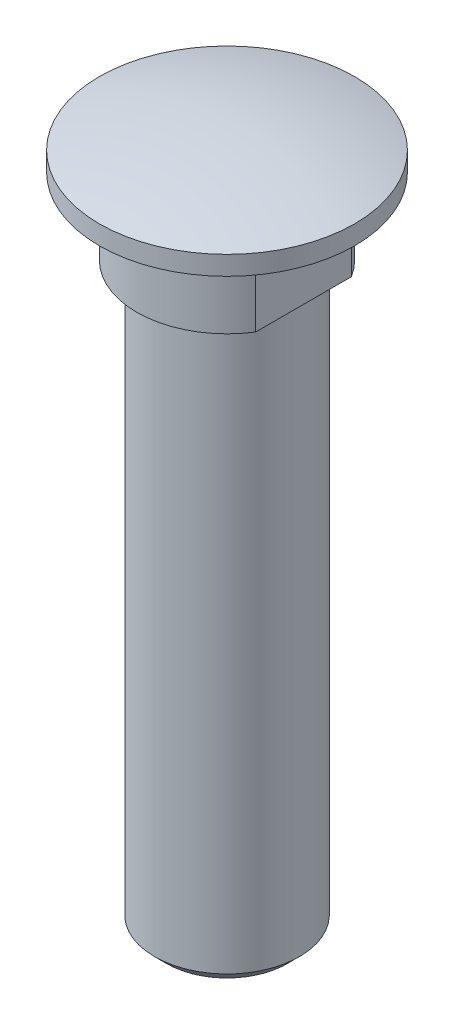
ISO-10303-21;
HEADER;
FILE_DESCRIPTION(('STEP AP214'),'2;1');
FILE_NAME('part.step','',(''),(''),'','','');
FILE_SCHEMA(('AUTOMOTIVE_DESIGN { 1 0 10303 214 1 1 1 1 }'));
ENDSEC;
DATA;
#1=APPLICATION_CONTEXT('core data for automotive mechanical design processes');
#2=APPLICATION_PROTOCOL_DEFINITION('international standard','automotive_design',2000,#1);
#3=PRODUCT_CONTEXT('',#1,'mechanical');
#4=PRODUCT('Part','Part','',(#3));
#5=PRODUCT_RELATED_PRODUCT_CATEGORY('part','',(#4));
#6=PRODUCT_DEFINITION_FORMATION('','',#4);
#7=PRODUCT_DEFINITION_CONTEXT('part definition',#1,'design');
#8=PRODUCT_DEFINITION('design','',#6,#7);
#9=PRODUCT_DEFINITION_SHAPE('','',#8);
#10=(LENGTH_UNIT() NAMED_UNIT(*) SI_UNIT(.MILLI.,.METRE.));
#11=(NAMED_UNIT(*) PLANE_ANGLE_UNIT() SI_UNIT($,.RADIAN.));
#12=(NAMED_UNIT(*) SI_UNIT($,.STERADIAN.) SOLID_ANGLE_UNIT());
#13=UNCERTAINTY_MEASURE_WITH_UNIT(LENGTH_MEASURE(1.E-05),#10,'distance_accuracy_value','');
#14=(GEOMETRIC_REPRESENTATION_CONTEXT(3) GLOBAL_UNCERTAINTY_ASSIGNED_CONTEXT((#13)) GLOBAL_UNIT_ASSIGNED_CONTEXT((#10,
#11,#12)) REPRESENTATION_CONTEXT('',''));
#15=CARTESIAN_POINT('',(0.,0.,0.));
#16=DIRECTION('',(0.,0.,1.));
#17=DIRECTION('',(1.,0.,0.));
#18=AXIS2_PLACEMENT_3D('',#15,#16,#17);
#19=CARTESIAN_POINT('',(0.,-2.3114,0.));
#20=DIRECTION('',(0.,1.,0.));
#21=DIRECTION('',(0.,0.,-1.));
#22=AXIS2_PLACEMENT_3D('',#19,#20,#21);
#23=CYLINDRICAL_SURFACE('',#22,2.413);
#24=CARTESIAN_POINT('',(0.,0.396875,0.));
#25=DIRECTION('',(0.,1.,0.));
#26=DIRECTION('',(0.,0.,1.));
#27=AXIS2_PLACEMENT_3D('',#24,#25,#26);
#28=CIRCLE('',#27,2.413);
#29=CARTESIAN_POINT('',(0.,0.396875,2.413));
#30=VERTEX_POINT('',#29);
#31=EDGE_CURVE('E9',#30,#30,#28,.T.);
#32=ORIENTED_EDGE('',*,*,#31,.T.);
#33=EDGE_LOOP('',(#32));
#34=FACE_BOUND('',#33,.T.);
#35=CARTESIAN_POINT('',(0.,19.2090675,0.));
#36=DIRECTION('',(0.,-1.,0.));
#37=DIRECTION('',(0.,0.,1.));
#38=AXIS2_PLACEMENT_3D('',#35,#36,#37);
#39=CIRCLE('',#38,2.413);
#40=CARTESIAN_POINT('',(0.,19.2090675,2.413));
#41=VERTEX_POINT('',#40);
#42=EDGE_CURVE('E84',#41,#41,#39,.T.);
#43=ORIENTED_EDGE('',*,*,#42,.T.);
#44=EDGE_LOOP('',(#43));
#45=FACE_BOUND('',#44,.T.);
#46=ADVANCED_FACE('F15',(#34,#45),#23,.T.);
#47=CARTESIAN_POINT('',(0.,0.,0.));
#48=DIRECTION('',(0.,1.,0.));
#49=DIRECTION('',(0.,0.,1.));
#50=AXIS2_PLACEMENT_3D('',#47,#48,#49);
#51=CONICAL_SURFACE('',#50,2.016125,0.785398163397449);
#52=ORIENTED_EDGE('',*,*,#31,.F.);
#53=EDGE_LOOP('',(#52));
#54=FACE_BOUND('',#53,.T.);
#55=CARTESIAN_POINT('',(0.,0.,0.));
#56=DIRECTION('',(0.,-1.,0.));
#57=DIRECTION('',(0.,0.,1.));
#58=AXIS2_PLACEMENT_3D('',#55,#56,#57);
#59=CIRCLE('',#58,2.016125);
#60=CARTESIAN_POINT('',(0.,0.,2.016125));
#61=VERTEX_POINT('',#60);
#62=EDGE_CURVE('E101',#61,#61,#59,.T.);
#63=ORIENTED_EDGE('',*,*,#62,.F.);
#64=EDGE_LOOP('',(#63));
#65=FACE_BOUND('',#64,.T.);
#66=ADVANCED_FACE('F17',(#54,#65),#51,.T.);
#67=CARTESIAN_POINT('',(-2.5527,19.304,3.73263621531094));
#68=DIRECTION('',(-1.,0.,0.));
#69=DIRECTION('',(0.,0.,1.));
#70=AXIS2_PLACEMENT_3D('',#67,#68,#69);
#71=PLANE('',#70);
#72=DIRECTION('',(0.,-1.,0.));
#73=VECTOR('',#72,1.);
#74=CARTESIAN_POINT('',(-2.5527,-2.3114,-1.59474785467797));
#75=LINE('',#74,#73);
#76=CARTESIAN_POINT('',(-2.5527,21.844,-1.59474785467798));
#77=VERTEX_POINT('',#76);
#78=CARTESIAN_POINT('',(-2.5527,19.304,-1.59474785467797));
#79=VERTEX_POINT('',#78);
#80=EDGE_CURVE('E26',#77,#79,#75,.T.);
#81=ORIENTED_EDGE('',*,*,#80,.T.);
#82=DIRECTION('',(0.,0.,-1.));
#83=VECTOR('',#82,1.);
#84=CARTESIAN_POINT('',(-2.5527,19.304,3.73263621531094));
#85=LINE('',#84,#83);
#86=CARTESIAN_POINT('',(-2.5527,19.304,1.59474785467798));
#87=VERTEX_POINT('',#86);
#88=EDGE_CURVE('E39',#87,#79,#85,.T.);
#89=ORIENTED_EDGE('',*,*,#88,.F.);
#90=DIRECTION('',(0.,1.,0.));
#91=VECTOR('',#90,1.);
#92=CARTESIAN_POINT('',(-2.5527,-2.3114,1.59474785467797));
#93=LINE('',#92,#91);
#94=CARTESIAN_POINT('',(-2.5527,21.844,1.59474785467798));
#95=VERTEX_POINT('',#94);
#96=EDGE_CURVE('E109',#87,#95,#93,.T.);
#97=ORIENTED_EDGE('',*,*,#96,.T.);
#98=DIRECTION('',(0.,0.,-1.));
#99=VECTOR('',#98,1.);
#100=CARTESIAN_POINT('',(-2.5527,21.844,3.73263621531094));
#101=LINE('',#100,#99);
#102=EDGE_CURVE('E107',#95,#77,#101,.T.);
#103=ORIENTED_EDGE('',*,*,#102,.T.);
#104=EDGE_LOOP('',(#81,#89,#97,#103));
#105=FACE_BOUND('',#104,.T.);
#106=ADVANCED_FACE('F148',(#105),#71,.T.);
#107=CARTESIAN_POINT('',(-4.2545,21.844,0.));
#108=DIRECTION('',(0.,1.,0.));
#109=DIRECTION('',(1.,0.,0.));
#110=AXIS2_PLACEMENT_3D('',#107,#108,#109);
#111=PLANE('',#110);
#112=CARTESIAN_POINT('',(0.,21.844,0.));
#113=DIRECTION('',(0.,-1.,0.));
#114=DIRECTION('',(0.,0.,-1.));
#115=AXIS2_PLACEMENT_3D('',#112,#113,#114);
#116=CIRCLE('',#115,4.2545);
#117=CARTESIAN_POINT('',(0.,21.844,-4.2545));
#118=VERTEX_POINT('',#117);
#119=EDGE_CURVE('E19',#118,#118,#116,.T.);
#120=ORIENTED_EDGE('',*,*,#119,.T.);
#121=EDGE_LOOP('',(#120));
#122=FACE_BOUND('',#121,.T.);
#123=DIRECTION('',(0.,0.,-1.));
#124=VECTOR('',#123,1.);
#125=CARTESIAN_POINT('',(2.5527,21.844,3.73263621531094));
#126=LINE('',#125,#124);
#127=CARTESIAN_POINT('',(2.5527,21.844,1.59474785467798));
#128=VERTEX_POINT('',#127);
#129=CARTESIAN_POINT('',(2.5527,21.844,-1.59474785467798));
#130=VERTEX_POINT('',#129);
#131=EDGE_CURVE('E117',#128,#130,#126,.T.);
#132=ORIENTED_EDGE('',*,*,#131,.T.);
#133=CARTESIAN_POINT('',(0.,21.844,0.));
#134=DIRECTION('',(0.,-1.,0.));
#135=DIRECTION('',(0.,0.,-1.));
#136=AXIS2_PLACEMENT_3D('',#133,#134,#135);
#137=CIRCLE('',#136,3.0099);
#138=EDGE_CURVE('E79',#77,#130,#137,.T.);
#139=ORIENTED_EDGE('',*,*,#138,.F.);
#140=ORIENTED_EDGE('',*,*,#102,.F.);
#141=EDGE_CURVE('E105',#128,#95,#137,.T.);
#142=ORIENTED_EDGE('',*,*,#141,.F.);
#143=EDGE_LOOP('',(#132,#139,#140,#142));
#144=FACE_BOUND('',#143,.T.);
#145=ADVANCED_FACE('F154',(#122,#144),#111,.F.);
#146=CARTESIAN_POINT('',(0.,-2.3114,0.));
#147=DIRECTION('',(0.,1.,0.));
#148=DIRECTION('',(0.,0.,-1.));
#149=AXIS2_PLACEMENT_3D('',#146,#147,#148);
#150=CYLINDRICAL_SURFACE('',#149,3.0099);
#151=ORIENTED_EDGE('',*,*,#96,.F.);
#152=CARTESIAN_POINT('',(0.,19.304,0.));
#153=DIRECTION('',(0.,-1.,0.));
#154=DIRECTION('',(0.,0.,-1.));
#155=AXIS2_PLACEMENT_3D('',#152,#153,#154);
#156=CIRCLE('',#155,3.0099);
#157=CARTESIAN_POINT('',(2.5527,19.304,1.59474785467798));
#158=VERTEX_POINT('',#157);
#159=EDGE_CURVE('E73',#158,#87,#156,.T.);
#160=ORIENTED_EDGE('',*,*,#159,.F.);
#161=DIRECTION('',(0.,1.,0.));
#162=VECTOR('',#161,1.);
#163=CARTESIAN_POINT('',(2.5527,-2.3114,1.59474785467798));
#164=LINE('',#163,#162);
#165=EDGE_CURVE('E89',#158,#128,#164,.T.);
#166=ORIENTED_EDGE('',*,*,#165,.T.);
#167=ORIENTED_EDGE('',*,*,#141,.T.);
#168=EDGE_LOOP('',(#151,#160,#166,#167));
#169=FACE_BOUND('',#168,.T.);
#170=ADVANCED_FACE('F146',(#169),#150,.T.);
#171=CARTESIAN_POINT('',(0.,19.2090675,0.));
#172=DIRECTION('',(0.,1.,0.));
#173=DIRECTION('',(0.,0.,1.));
#174=AXIS2_PLACEMENT_3D('',#171,#172,#173);
#175=TOROIDAL_SURFACE('',#174,2.5079325,0.0949325);
#176=ORIENTED_EDGE('',*,*,#42,.F.);
#177=EDGE_LOOP('',(#176));
#178=FACE_BOUND('',#177,.T.);
#179=CARTESIAN_POINT('',(0.,19.304,0.));
#180=DIRECTION('',(0.,1.,0.));
#181=DIRECTION('',(0.,0.,1.));
#182=AXIS2_PLACEMENT_3D('',#179,#180,#181);
#183=CIRCLE('',#182,2.5079325);
#184=CARTESIAN_POINT('',(0.,19.304,2.5079325));
#185=VERTEX_POINT('',#184);
#186=EDGE_CURVE('E134',#185,#185,#183,.T.);
#187=ORIENTED_EDGE('',*,*,#186,.F.);
#188=EDGE_LOOP('',(#187));
#189=FACE_BOUND('',#188,.T.);
#190=ADVANCED_FACE('F241',(#178,#189),#175,.F.);
#191=CARTESIAN_POINT('',(0.,0.,0.));
#192=DIRECTION('',(0.,1.,0.));
#193=DIRECTION('',(1.,0.,0.));
#194=AXIS2_PLACEMENT_3D('',#191,#192,#193);
#195=PLANE('',#194);
#196=ORIENTED_EDGE('',*,*,#62,.T.);
#197=EDGE_LOOP('',(#196));
#198=FACE_BOUND('',#197,.T.);
#199=ADVANCED_FACE('F250',(#198),#195,.F.);
#200=ORIENTED_EDGE('',*,*,#80,.F.);
#201=ORIENTED_EDGE('',*,*,#138,.T.);
#202=DIRECTION('',(0.,-1.,0.));
#203=VECTOR('',#202,1.);
#204=CARTESIAN_POINT('',(2.5527,-2.3114,-1.59474785467798));
#205=LINE('',#204,#203);
#206=CARTESIAN_POINT('',(2.5527,19.304,-1.59474785467797));
#207=VERTEX_POINT('',#206);
#208=EDGE_CURVE('E76',#130,#207,#205,.T.);
#209=ORIENTED_EDGE('',*,*,#208,.T.);
#210=EDGE_CURVE('E64',#79,#207,#156,.T.);
#211=ORIENTED_EDGE('',*,*,#210,.F.);
#212=EDGE_LOOP('',(#200,#201,#209,#211));
#213=FACE_BOUND('',#212,.T.);
#214=ADVANCED_FACE('F77',(#213),#150,.T.);
#215=CARTESIAN_POINT('',(2.5527,19.304,3.73263621531094));
#216=DIRECTION('',(-1.,0.,0.));
#217=DIRECTION('',(0.,0.,1.));
#218=AXIS2_PLACEMENT_3D('',#215,#216,#217);
#219=PLANE('',#218);
#220=ORIENTED_EDGE('',*,*,#131,.F.);
#221=ORIENTED_EDGE('',*,*,#165,.F.);
#222=DIRECTION('',(0.,0.,-1.));
#223=VECTOR('',#222,1.);
#224=CARTESIAN_POINT('',(2.5527,19.304,3.73263621531094));
#225=LINE('',#224,#223);
#226=EDGE_CURVE('E69',#158,#207,#225,.T.);
#227=ORIENTED_EDGE('',*,*,#226,.T.);
#228=ORIENTED_EDGE('',*,*,#208,.F.);
#229=EDGE_LOOP('',(#220,#221,#227,#228));
#230=FACE_BOUND('',#229,.T.);
#231=ADVANCED_FACE('F87',(#230),#219,.F.);
#232=CARTESIAN_POINT('',(-3.0099,19.304,0.));
#233=DIRECTION('',(0.,1.,0.));
#234=DIRECTION('',(1.,0.,0.));
#235=AXIS2_PLACEMENT_3D('',#232,#233,#234);
#236=PLANE('',#235);
#237=ORIENTED_EDGE('',*,*,#88,.T.);
#238=ORIENTED_EDGE('',*,*,#210,.T.);
#239=ORIENTED_EDGE('',*,*,#226,.F.);
#240=ORIENTED_EDGE('',*,*,#159,.T.);
#241=EDGE_LOOP('',(#237,#238,#239,#240));
#242=FACE_BOUND('',#241,.T.);
#243=ORIENTED_EDGE('',*,*,#186,.T.);
#244=EDGE_LOOP('',(#243));
#245=FACE_BOUND('',#244,.T.);
#246=ADVANCED_FACE('F66',(#242,#245),#236,.F.);
#247=CARTESIAN_POINT('',(0.,22.8219,0.));
#248=DIRECTION('',(0.,1.,0.));
#249=DIRECTION('',(1.,0.,0.));
#250=AXIS2_PLACEMENT_3D('',#247,#248,#249);
#251=CYLINDRICAL_SURFACE('',#250,4.25449999999903);
#252=CARTESIAN_POINT('',(0.,22.479,0.));
#253=DIRECTION('',(0.,-1.,0.));
#254=DIRECTION('',(1.,0.,0.));
#255=AXIS2_PLACEMENT_3D('',#252,#253,#254);
#256=CIRCLE('',#255,4.25449999999903);
#257=CARTESIAN_POINT('',(4.25449999999902,22.4790000000001,0.));
#258=VERTEX_POINT('',#257);
#259=EDGE_CURVE('E132',#258,#258,#256,.T.);
#260=ORIENTED_EDGE('',*,*,#259,.T.);
#261=EDGE_LOOP('',(#260));
#262=FACE_BOUND('',#261,.T.);
#263=ORIENTED_EDGE('',*,*,#119,.F.);
#264=EDGE_LOOP('',(#263));
#265=FACE_BOUND('',#264,.T.);
#266=ADVANCED_FACE('F288',(#262,#265),#251,.T.);
#267=CARTESIAN_POINT('',(4.28925868037615E-13,8.54392500000261,0.));
#268=DIRECTION('',(0.,-1.,0.));
#269=DIRECTION('',(-1.,0.,0.));
#270=AXIS2_PLACEMENT_3D('',#267,#268,#269);
#271=SPHERICAL_SURFACE('',#270,14.5700749999973);
#272=ORIENTED_EDGE('',*,*,#259,.F.);
#273=EDGE_LOOP('',(#272));
#274=FACE_BOUND('',#273,.T.);
#275=ADVANCED_FACE('F298',(#274),#271,.T.);
#276=CLOSED_SHELL('',(#46,#66,#106,#145,#170,#190,#199,#214,#231,#246,#266,#275));
#277=MANIFOLD_SOLID_BREP('B1',#276);
#278=ADVANCED_BREP_SHAPE_REPRESENTATION('',(#18,#277),#14);
#279=SHAPE_DEFINITION_REPRESENTATION(#9,#278);
ENDSEC;
END-ISO-10303-21;
